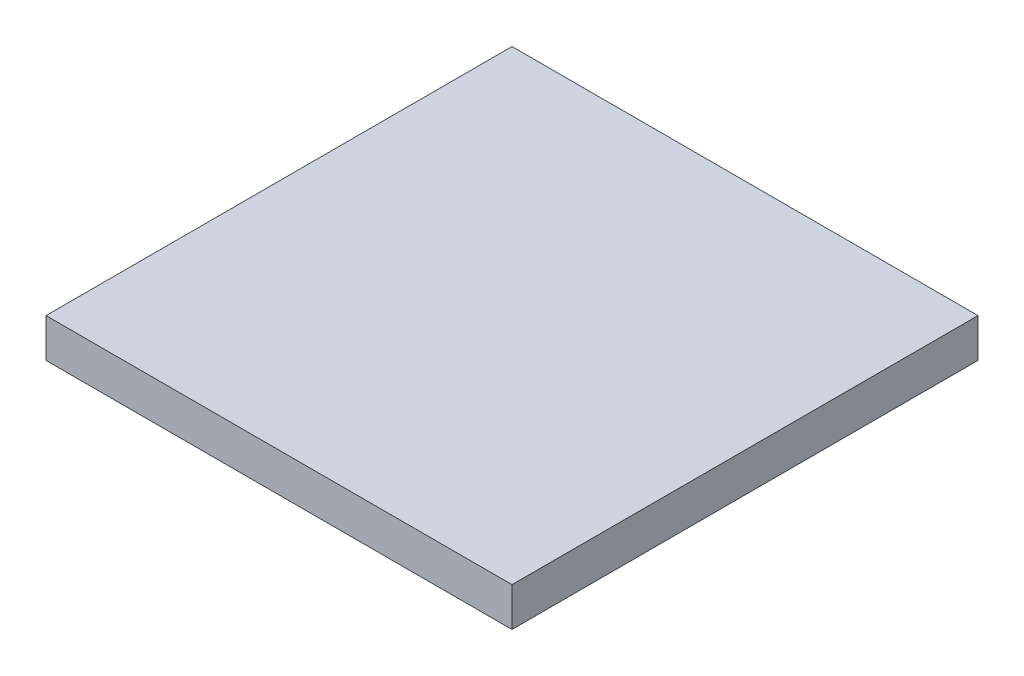
ISO-10303-21;
HEADER;
FILE_DESCRIPTION(('STEP AP214'),'2;1');
FILE_NAME('part.step','',(''),(''),'','','');
FILE_SCHEMA(('AUTOMOTIVE_DESIGN { 1 0 10303 214 1 1 1 1 }'));
ENDSEC;
DATA;
#1=APPLICATION_CONTEXT('core data for automotive mechanical design processes');
#2=APPLICATION_PROTOCOL_DEFINITION('international standard','automotive_design',2000,#1);
#3=PRODUCT_CONTEXT('',#1,'mechanical');
#4=PRODUCT('Part','Part','',(#3));
#5=PRODUCT_RELATED_PRODUCT_CATEGORY('part','',(#4));
#6=PRODUCT_DEFINITION_FORMATION('','',#4);
#7=PRODUCT_DEFINITION_CONTEXT('part definition',#1,'design');
#8=PRODUCT_DEFINITION('design','',#6,#7);
#9=PRODUCT_DEFINITION_SHAPE('','',#8);
#10=(LENGTH_UNIT() NAMED_UNIT(*) SI_UNIT(.MILLI.,.METRE.));
#11=(NAMED_UNIT(*) PLANE_ANGLE_UNIT() SI_UNIT($,.RADIAN.));
#12=(NAMED_UNIT(*) SI_UNIT($,.STERADIAN.) SOLID_ANGLE_UNIT());
#13=UNCERTAINTY_MEASURE_WITH_UNIT(LENGTH_MEASURE(1.E-05),#10,'distance_accuracy_value','');
#14=(GEOMETRIC_REPRESENTATION_CONTEXT(3) GLOBAL_UNCERTAINTY_ASSIGNED_CONTEXT((#13)) GLOBAL_UNIT_ASSIGNED_CONTEXT((#10,
#11,#12)) REPRESENTATION_CONTEXT('',''));
#15=CARTESIAN_POINT('',(0.,0.,0.));
#16=DIRECTION('',(0.,0.,1.));
#17=DIRECTION('',(1.,0.,0.));
#18=AXIS2_PLACEMENT_3D('',#15,#16,#17);
#19=CARTESIAN_POINT('',(-19.05,3.175,-19.05));
#20=DIRECTION('',(1.,0.,0.));
#21=DIRECTION('',(0.,0.,-1.));
#22=AXIS2_PLACEMENT_3D('',#19,#20,#21);
#23=PLANE('',#22);
#24=DIRECTION('',(0.,0.,1.));
#25=VECTOR('',#24,1.);
#26=CARTESIAN_POINT('',(-19.05,0.,-19.05));
#27=LINE('',#26,#25);
#28=CARTESIAN_POINT('',(-19.05,0.,-19.05));
#29=VERTEX_POINT('',#28);
#30=CARTESIAN_POINT('',(-19.05,0.,19.05));
#31=VERTEX_POINT('',#30);
#32=EDGE_CURVE('E96',#29,#31,#27,.T.);
#33=ORIENTED_EDGE('',*,*,#32,.T.);
#34=DIRECTION('',(0.,-1.,0.));
#35=VECTOR('',#34,1.);
#36=CARTESIAN_POINT('',(-19.05,3.175,19.05));
#37=LINE('',#36,#35);
#38=CARTESIAN_POINT('',(-19.05,3.175,19.05));
#39=VERTEX_POINT('',#38);
#40=EDGE_CURVE('E11',#39,#31,#37,.T.);
#41=ORIENTED_EDGE('',*,*,#40,.F.);
#42=DIRECTION('',(0.,0.,1.));
#43=VECTOR('',#42,1.);
#44=CARTESIAN_POINT('',(-19.05,3.175,-19.05));
#45=LINE('',#44,#43);
#46=CARTESIAN_POINT('',(-19.05,3.175,-19.05));
#47=VERTEX_POINT('',#46);
#48=EDGE_CURVE('E84',#47,#39,#45,.T.);
#49=ORIENTED_EDGE('',*,*,#48,.F.);
#50=DIRECTION('',(0.,-1.,0.));
#51=VECTOR('',#50,1.);
#52=CARTESIAN_POINT('',(-19.05,3.175,-19.05));
#53=LINE('',#52,#51);
#54=EDGE_CURVE('E92',#47,#29,#53,.T.);
#55=ORIENTED_EDGE('',*,*,#54,.T.);
#56=EDGE_LOOP('',(#33,#41,#49,#55));
#57=FACE_BOUND('',#56,.T.);
#58=ADVANCED_FACE('F33',(#57),#23,.F.);
#59=CARTESIAN_POINT('',(-19.05,3.175,19.05));
#60=DIRECTION('',(0.,0.,-1.));
#61=DIRECTION('',(-1.,0.,0.));
#62=AXIS2_PLACEMENT_3D('',#59,#60,#61);
#63=PLANE('',#62);
#64=DIRECTION('',(1.,0.,0.));
#65=VECTOR('',#64,1.);
#66=CARTESIAN_POINT('',(-19.05,0.,19.05));
#67=LINE('',#66,#65);
#68=CARTESIAN_POINT('',(19.05,0.,19.05));
#69=VERTEX_POINT('',#68);
#70=EDGE_CURVE('E88',#31,#69,#67,.T.);
#71=ORIENTED_EDGE('',*,*,#70,.T.);
#72=DIRECTION('',(0.,-1.,0.));
#73=VECTOR('',#72,1.);
#74=CARTESIAN_POINT('',(19.05,3.175,19.05));
#75=LINE('',#74,#73);
#76=CARTESIAN_POINT('',(19.05,3.175,19.05));
#77=VERTEX_POINT('',#76);
#78=EDGE_CURVE('E41',#77,#69,#75,.T.);
#79=ORIENTED_EDGE('',*,*,#78,.F.);
#80=DIRECTION('',(1.,0.,0.));
#81=VECTOR('',#80,1.);
#82=CARTESIAN_POINT('',(-19.05,3.175,19.05));
#83=LINE('',#82,#81);
#84=EDGE_CURVE('E79',#39,#77,#83,.T.);
#85=ORIENTED_EDGE('',*,*,#84,.F.);
#86=ORIENTED_EDGE('',*,*,#40,.T.);
#87=EDGE_LOOP('',(#71,#79,#85,#86));
#88=FACE_BOUND('',#87,.T.);
#89=ADVANCED_FACE('F87',(#88),#63,.F.);
#90=CARTESIAN_POINT('',(19.05,3.175,-19.05));
#91=DIRECTION('',(-1.,0.,0.));
#92=DIRECTION('',(0.,0.,1.));
#93=AXIS2_PLACEMENT_3D('',#90,#91,#92);
#94=PLANE('',#93);
#95=DIRECTION('',(0.,0.,-1.));
#96=VECTOR('',#95,1.);
#97=CARTESIAN_POINT('',(19.05,0.,-19.05));
#98=LINE('',#97,#96);
#99=CARTESIAN_POINT('',(19.05,0.,-19.05));
#100=VERTEX_POINT('',#99);
#101=EDGE_CURVE('E66',#69,#100,#98,.T.);
#102=ORIENTED_EDGE('',*,*,#101,.T.);
#103=DIRECTION('',(0.,-1.,0.));
#104=VECTOR('',#103,1.);
#105=CARTESIAN_POINT('',(19.05,3.175,-19.05));
#106=LINE('',#105,#104);
#107=CARTESIAN_POINT('',(19.05,3.175,-19.05));
#108=VERTEX_POINT('',#107);
#109=EDGE_CURVE('E89',#108,#100,#106,.T.);
#110=ORIENTED_EDGE('',*,*,#109,.F.);
#111=DIRECTION('',(0.,0.,-1.));
#112=VECTOR('',#111,1.);
#113=CARTESIAN_POINT('',(19.05,3.175,-19.05));
#114=LINE('',#113,#112);
#115=EDGE_CURVE('E82',#77,#108,#114,.T.);
#116=ORIENTED_EDGE('',*,*,#115,.F.);
#117=ORIENTED_EDGE('',*,*,#78,.T.);
#118=EDGE_LOOP('',(#102,#110,#116,#117));
#119=FACE_BOUND('',#118,.T.);
#120=ADVANCED_FACE('F90',(#119),#94,.F.);
#121=CARTESIAN_POINT('',(-19.05,3.175,-19.05));
#122=DIRECTION('',(0.,0.,1.));
#123=DIRECTION('',(1.,0.,0.));
#124=AXIS2_PLACEMENT_3D('',#121,#122,#123);
#125=PLANE('',#124);
#126=DIRECTION('',(-1.,0.,0.));
#127=VECTOR('',#126,1.);
#128=CARTESIAN_POINT('',(-19.05,0.,-19.05));
#129=LINE('',#128,#127);
#130=EDGE_CURVE('E72',#100,#29,#129,.T.);
#131=ORIENTED_EDGE('',*,*,#130,.T.);
#132=ORIENTED_EDGE('',*,*,#54,.F.);
#133=DIRECTION('',(-1.,0.,0.));
#134=VECTOR('',#133,1.);
#135=CARTESIAN_POINT('',(-19.05,3.175,-19.05));
#136=LINE('',#135,#134);
#137=EDGE_CURVE('E49',#108,#47,#136,.T.);
#138=ORIENTED_EDGE('',*,*,#137,.F.);
#139=ORIENTED_EDGE('',*,*,#109,.T.);
#140=EDGE_LOOP('',(#131,#132,#138,#139));
#141=FACE_BOUND('',#140,.T.);
#142=ADVANCED_FACE('F103',(#141),#125,.F.);
#143=CARTESIAN_POINT('',(0.,3.175,0.));
#144=DIRECTION('',(0.,1.,0.));
#145=DIRECTION('',(0.,0.,1.));
#146=AXIS2_PLACEMENT_3D('',#143,#144,#145);
#147=PLANE('',#146);
#148=ORIENTED_EDGE('',*,*,#48,.T.);
#149=ORIENTED_EDGE('',*,*,#84,.T.);
#150=ORIENTED_EDGE('',*,*,#115,.T.);
#151=ORIENTED_EDGE('',*,*,#137,.T.);
#152=EDGE_LOOP('',(#148,#149,#150,#151));
#153=FACE_BOUND('',#152,.T.);
#154=ADVANCED_FACE('F80',(#153),#147,.T.);
#155=CARTESIAN_POINT('',(0.,0.,0.));
#156=DIRECTION('',(0.,1.,0.));
#157=DIRECTION('',(0.,0.,1.));
#158=AXIS2_PLACEMENT_3D('',#155,#156,#157);
#159=PLANE('',#158);
#160=ORIENTED_EDGE('',*,*,#32,.F.);
#161=ORIENTED_EDGE('',*,*,#130,.F.);
#162=ORIENTED_EDGE('',*,*,#101,.F.);
#163=ORIENTED_EDGE('',*,*,#70,.F.);
#164=EDGE_LOOP('',(#160,#161,#162,#163));
#165=FACE_BOUND('',#164,.T.);
#166=ADVANCED_FACE('F106',(#165),#159,.F.);
#167=CLOSED_SHELL('',(#58,#89,#120,#142,#154,#166));
#168=MANIFOLD_SOLID_BREP('B2',#167);
#169=ADVANCED_BREP_SHAPE_REPRESENTATION('',(#18,#168),#14);
#170=SHAPE_DEFINITION_REPRESENTATION(#9,#169);
ENDSEC;
END-ISO-10303-21;
